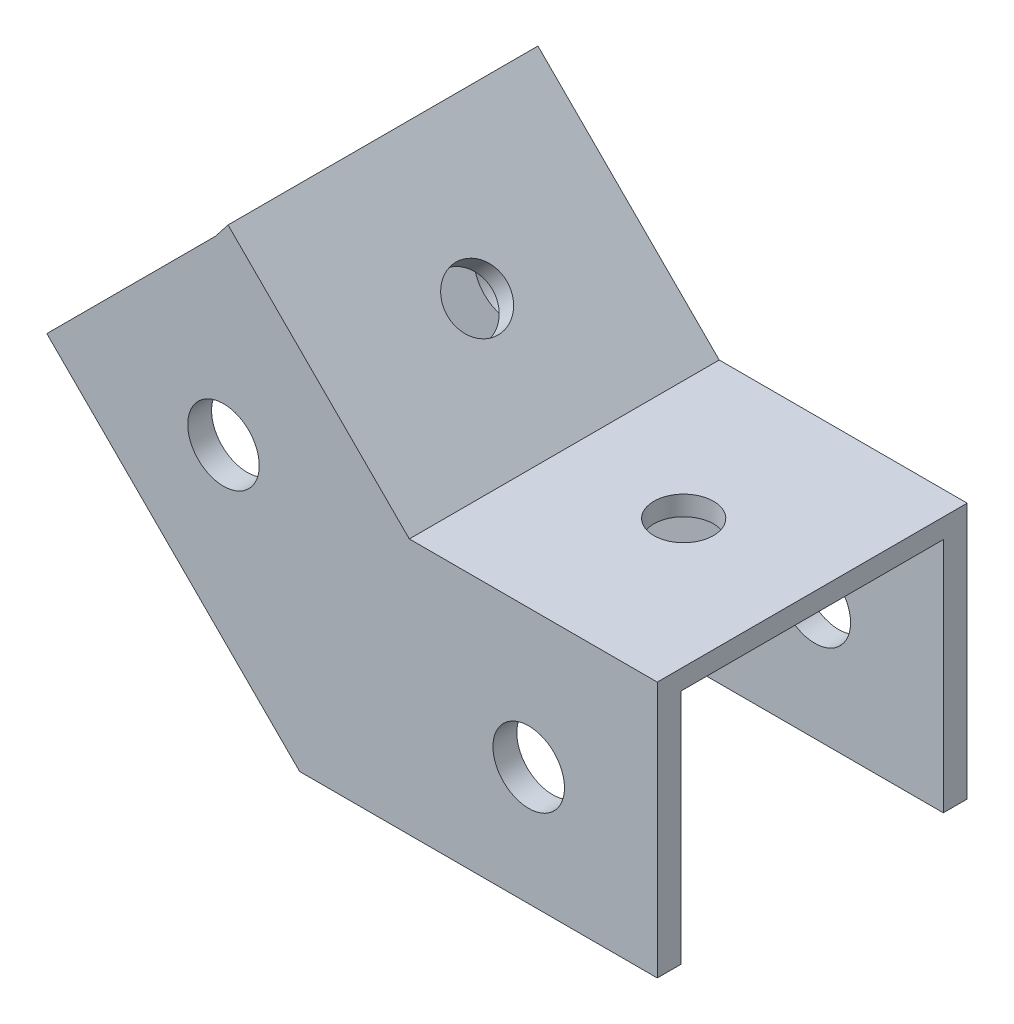
ISO-10303-21;
HEADER;
FILE_DESCRIPTION(('STEP AP214'),'2;1');
FILE_NAME('part.step','',(''),(''),'','','');
FILE_SCHEMA(('AUTOMOTIVE_DESIGN { 1 0 10303 214 1 1 1 1 }'));
ENDSEC;
DATA;
#1=APPLICATION_CONTEXT('core data for automotive mechanical design processes');
#2=APPLICATION_PROTOCOL_DEFINITION('international standard','automotive_design',2000,#1);
#3=PRODUCT_CONTEXT('',#1,'mechanical');
#4=PRODUCT('Part','Part','',(#3));
#5=PRODUCT_RELATED_PRODUCT_CATEGORY('part','',(#4));
#6=PRODUCT_DEFINITION_FORMATION('','',#4);
#7=PRODUCT_DEFINITION_CONTEXT('part definition',#1,'design');
#8=PRODUCT_DEFINITION('design','',#6,#7);
#9=PRODUCT_DEFINITION_SHAPE('','',#8);
#10=(LENGTH_UNIT() NAMED_UNIT(*) SI_UNIT(.MILLI.,.METRE.));
#11=(NAMED_UNIT(*) PLANE_ANGLE_UNIT() SI_UNIT($,.RADIAN.));
#12=(NAMED_UNIT(*) SI_UNIT($,.STERADIAN.) SOLID_ANGLE_UNIT());
#13=UNCERTAINTY_MEASURE_WITH_UNIT(LENGTH_MEASURE(1.E-05),#10,'distance_accuracy_value','');
#14=(GEOMETRIC_REPRESENTATION_CONTEXT(3) GLOBAL_UNCERTAINTY_ASSIGNED_CONTEXT((#13)) GLOBAL_UNIT_ASSIGNED_CONTEXT((#10,
#11,#12)) REPRESENTATION_CONTEXT('',''));
#15=CARTESIAN_POINT('',(0.,0.,0.));
#16=DIRECTION('',(0.,0.,1.));
#17=DIRECTION('',(1.,0.,0.));
#18=AXIS2_PLACEMENT_3D('',#15,#16,#17);
#19=CARTESIAN_POINT('',(29.6036555499137,-29.6036555499137,2.));
#20=DIRECTION('',(-0.707106781186548,0.707106781186547,0.));
#21=DIRECTION('',(-0.707106781186547,-0.707106781186548,0.));
#22=AXIS2_PLACEMENT_3D('',#19,#20,#21);
#23=PLANE('',#22);
#24=DIRECTION('',(0.707106781186547,0.707106781186548,0.));
#25=VECTOR('',#24,1.);
#26=CARTESIAN_POINT('',(29.6036555499137,-29.6036555499137,0.));
#27=LINE('',#26,#25);
#28=CARTESIAN_POINT('',(-93.5794854645758,-152.786796564403,0.));
#29=VERTEX_POINT('',#28);
#30=CARTESIAN_POINT('',(-79.4373498408449,-138.644660940672,0.));
#31=VERTEX_POINT('',#30);
#32=EDGE_CURVE('E241',#29,#31,#27,.T.);
#33=ORIENTED_EDGE('',*,*,#32,.F.);
#34=DIRECTION('',(0.,0.,-1.));
#35=VECTOR('',#34,1.);
#36=CARTESIAN_POINT('',(-93.5794854645758,-152.786796564403,2.));
#37=LINE('',#36,#35);
#38=CARTESIAN_POINT('',(-93.5794854645758,-152.786796564403,2.));
#39=VERTEX_POINT('',#38);
#40=EDGE_CURVE('E44',#39,#29,#37,.T.);
#41=ORIENTED_EDGE('',*,*,#40,.F.);
#42=DIRECTION('',(0.707106781186547,0.707106781186548,0.));
#43=VECTOR('',#42,1.);
#44=CARTESIAN_POINT('',(29.6036555499137,-29.6036555499137,2.));
#45=LINE('',#44,#43);
#46=CARTESIAN_POINT('',(-79.4373498408449,-138.644660940672,2.));
#47=VERTEX_POINT('',#46);
#48=EDGE_CURVE('E83',#39,#47,#45,.T.);
#49=ORIENTED_EDGE('',*,*,#48,.T.);
#50=DIRECTION('',(0.,0.,-1.));
#51=VECTOR('',#50,1.);
#52=CARTESIAN_POINT('',(-79.4373498408449,-138.644660940672,2.));
#53=LINE('',#52,#51);
#54=EDGE_CURVE('E11',#47,#31,#53,.T.);
#55=ORIENTED_EDGE('',*,*,#54,.T.);
#56=EDGE_LOOP('',(#33,#41,#49,#55));
#57=FACE_BOUND('',#56,.T.);
#58=ADVANCED_FACE('F35',(#57),#23,.T.);
#59=CARTESIAN_POINT('',(-123.18314101449,-123.18314101449,2.));
#60=DIRECTION('',(-0.707106781186547,-0.707106781186547,0.));
#61=DIRECTION('',(0.707106781186548,-0.707106781186548,0.));
#62=AXIS2_PLACEMENT_3D('',#59,#60,#61);
#63=PLANE('',#62);
#64=DIRECTION('',(-0.707106781186548,0.707106781186548,0.));
#65=VECTOR('',#64,1.);
#66=CARTESIAN_POINT('',(-123.18314101449,-123.18314101449,0.));
#67=LINE('',#66,#65);
#68=CARTESIAN_POINT('',(-72.3662820289794,-174.,0.));
#69=VERTEX_POINT('',#68);
#70=EDGE_CURVE('E244',#69,#29,#67,.T.);
#71=ORIENTED_EDGE('',*,*,#70,.F.);
#72=DIRECTION('',(0.,0.,-1.));
#73=VECTOR('',#72,1.);
#74=CARTESIAN_POINT('',(-72.3662820289794,-174.,2.));
#75=LINE('',#74,#73);
#76=CARTESIAN_POINT('',(-72.3662820289794,-174.,2.));
#77=VERTEX_POINT('',#76);
#78=EDGE_CURVE('E254',#77,#69,#75,.T.);
#79=ORIENTED_EDGE('',*,*,#78,.F.);
#80=DIRECTION('',(-0.707106781186548,0.707106781186548,0.));
#81=VECTOR('',#80,1.);
#82=CARTESIAN_POINT('',(-123.18314101449,-123.18314101449,2.));
#83=LINE('',#82,#81);
#84=EDGE_CURVE('E227',#77,#39,#83,.T.);
#85=ORIENTED_EDGE('',*,*,#84,.T.);
#86=ORIENTED_EDGE('',*,*,#40,.T.);
#87=EDGE_LOOP('',(#71,#79,#85,#86));
#88=FACE_BOUND('',#87,.T.);
#89=ADVANCED_FACE('F258',(#88),#63,.T.);
#90=CARTESIAN_POINT('',(0.,-174.,2.));
#91=DIRECTION('',(0.,-1.,0.));
#92=DIRECTION('',(0.,0.,-1.));
#93=AXIS2_PLACEMENT_3D('',#90,#91,#92);
#94=PLANE('',#93);
#95=DIRECTION('',(-1.,0.,0.));
#96=VECTOR('',#95,1.);
#97=CARTESIAN_POINT('',(0.,-174.,0.));
#98=LINE('',#97,#96);
#99=CARTESIAN_POINT('',(-42.3662820289794,-174.,0.));
#100=VERTEX_POINT('',#99);
#101=EDGE_CURVE('E247',#100,#69,#98,.T.);
#102=ORIENTED_EDGE('',*,*,#101,.F.);
#103=DIRECTION('',(0.,0.,-1.));
#104=VECTOR('',#103,1.);
#105=CARTESIAN_POINT('',(-42.3662820289794,-174.,2.));
#106=LINE('',#105,#104);
#107=CARTESIAN_POINT('',(-42.3662820289794,-174.,2.));
#108=VERTEX_POINT('',#107);
#109=EDGE_CURVE('E52',#108,#100,#106,.T.);
#110=ORIENTED_EDGE('',*,*,#109,.F.);
#111=DIRECTION('',(-1.,0.,0.));
#112=VECTOR('',#111,1.);
#113=CARTESIAN_POINT('',(0.,-174.,2.));
#114=LINE('',#113,#112);
#115=EDGE_CURVE('E230',#108,#77,#114,.T.);
#116=ORIENTED_EDGE('',*,*,#115,.T.);
#117=ORIENTED_EDGE('',*,*,#78,.T.);
#118=EDGE_LOOP('',(#102,#110,#116,#117));
#119=FACE_BOUND('',#118,.T.);
#120=ADVANCED_FACE('F262',(#119),#94,.T.);
#121=CARTESIAN_POINT('',(-42.3662820289794,0.,2.));
#122=DIRECTION('',(1.,0.,0.));
#123=DIRECTION('',(0.,0.,-1.));
#124=AXIS2_PLACEMENT_3D('',#121,#122,#123);
#125=PLANE('',#124);
#126=DIRECTION('',(0.,-1.,0.));
#127=VECTOR('',#126,1.);
#128=CARTESIAN_POINT('',(-42.3662820289794,0.,0.));
#129=LINE('',#128,#127);
#130=CARTESIAN_POINT('',(-42.3662820289794,-154.14656108803,0.));
#131=VERTEX_POINT('',#130);
#132=EDGE_CURVE('E250',#131,#100,#129,.T.);
#133=ORIENTED_EDGE('',*,*,#132,.F.);
#134=DIRECTION('',(0.,0.,1.));
#135=VECTOR('',#134,1.);
#136=CARTESIAN_POINT('',(-42.3662820289794,-154.14656108803,-11.));
#137=LINE('',#136,#135);
#138=CARTESIAN_POINT('',(-42.3662820289794,-154.14656108803,-22.));
#139=VERTEX_POINT('',#138);
#140=EDGE_CURVE('E147',#139,#131,#137,.T.);
#141=ORIENTED_EDGE('',*,*,#140,.F.);
#142=DIRECTION('',(0.,-1.,0.));
#143=VECTOR('',#142,1.);
#144=CARTESIAN_POINT('',(-42.3662820289794,0.,-22.));
#145=LINE('',#144,#143);
#146=CARTESIAN_POINT('',(-42.3662820289794,-174.,-22.));
#147=VERTEX_POINT('',#146);
#148=EDGE_CURVE('E187',#139,#147,#145,.T.);
#149=ORIENTED_EDGE('',*,*,#148,.T.);
#150=DIRECTION('',(0.,0.,1.));
#151=VECTOR('',#150,1.);
#152=CARTESIAN_POINT('',(-42.3662820289794,-174.,-24.));
#153=LINE('',#152,#151);
#154=CARTESIAN_POINT('',(-42.3662820289794,-174.,-24.));
#155=VERTEX_POINT('',#154);
#156=EDGE_CURVE('E160',#155,#147,#153,.T.);
#157=ORIENTED_EDGE('',*,*,#156,.F.);
#158=DIRECTION('',(0.,-1.,0.));
#159=VECTOR('',#158,1.);
#160=CARTESIAN_POINT('',(-42.3662820289794,0.,-24.));
#161=LINE('',#160,#159);
#162=CARTESIAN_POINT('',(-42.3662820289794,-152.5,-24.));
#163=VERTEX_POINT('',#162);
#164=EDGE_CURVE('E152',#163,#155,#161,.T.);
#165=ORIENTED_EDGE('',*,*,#164,.F.);
#166=DIRECTION('',(0.,0.,1.));
#167=VECTOR('',#166,1.);
#168=CARTESIAN_POINT('',(-42.3662820289794,-152.5,-11.));
#169=LINE('',#168,#167);
#170=CARTESIAN_POINT('',(-42.3662820289794,-152.5,2.));
#171=VERTEX_POINT('',#170);
#172=EDGE_CURVE('E138',#163,#171,#169,.T.);
#173=ORIENTED_EDGE('',*,*,#172,.T.);
#174=DIRECTION('',(0.,-1.,0.));
#175=VECTOR('',#174,1.);
#176=CARTESIAN_POINT('',(-42.3662820289794,0.,2.));
#177=LINE('',#176,#175);
#178=EDGE_CURVE('E232',#171,#108,#177,.T.);
#179=ORIENTED_EDGE('',*,*,#178,.T.);
#180=ORIENTED_EDGE('',*,*,#109,.T.);
#181=EDGE_LOOP('',(#133,#141,#149,#157,#165,#173,#179,#180));
#182=FACE_BOUND('',#181,.T.);
#183=ADVANCED_FACE('F158',(#182),#125,.T.);
#184=CARTESIAN_POINT('',(-78.7574675790314,-153.466678826217,2.));
#185=DIRECTION('',(0.,0.,-1.));
#186=DIRECTION('',(-1.,0.,0.));
#187=AXIS2_PLACEMENT_3D('',#184,#185,#186);
#188=CYLINDRICAL_SURFACE('',#187,3.00000000000001);
#189=CARTESIAN_POINT('',(-78.7574675790314,-153.466678826217,2.));
#190=DIRECTION('',(0.,0.,1.));
#191=DIRECTION('',(1.,0.,0.));
#192=AXIS2_PLACEMENT_3D('',#189,#190,#191);
#193=CIRCLE('',#192,3.00000000000001);
#194=CARTESIAN_POINT('',(-75.7574675790314,-153.466678826217,2.));
#195=VERTEX_POINT('',#194);
#196=EDGE_CURVE('E223',#195,#195,#193,.T.);
#197=ORIENTED_EDGE('',*,*,#196,.T.);
#198=EDGE_LOOP('',(#197));
#199=FACE_BOUND('',#198,.T.);
#200=CARTESIAN_POINT('',(-78.7574675790314,-153.466678826217,0.));
#201=DIRECTION('',(0.,0.,1.));
#202=DIRECTION('',(1.,0.,0.));
#203=AXIS2_PLACEMENT_3D('',#200,#201,#202);
#204=CIRCLE('',#203,3.00000000000001);
#205=CARTESIAN_POINT('',(-75.7574675790314,-153.466678826217,0.));
#206=VERTEX_POINT('',#205);
#207=EDGE_CURVE('E236',#206,#206,#204,.T.);
#208=ORIENTED_EDGE('',*,*,#207,.F.);
#209=EDGE_LOOP('',(#208));
#210=FACE_BOUND('',#209,.T.);
#211=ADVANCED_FACE('F335',(#199,#210),#188,.F.);
#212=CARTESIAN_POINT('',(-53.1508658612332,-164.073280544015,2.));
#213=DIRECTION('',(0.,0.,-1.));
#214=DIRECTION('',(-1.,0.,0.));
#215=AXIS2_PLACEMENT_3D('',#212,#213,#214);
#216=CYLINDRICAL_SURFACE('',#215,3.);
#217=CARTESIAN_POINT('',(-53.1508658612332,-164.073280544015,2.));
#218=DIRECTION('',(0.,0.,1.));
#219=DIRECTION('',(1.,0.,0.));
#220=AXIS2_PLACEMENT_3D('',#217,#218,#219);
#221=CIRCLE('',#220,3.);
#222=CARTESIAN_POINT('',(-50.1508658612332,-164.073280544015,2.));
#223=VERTEX_POINT('',#222);
#224=EDGE_CURVE('E220',#223,#223,#221,.T.);
#225=ORIENTED_EDGE('',*,*,#224,.T.);
#226=EDGE_LOOP('',(#225));
#227=FACE_BOUND('',#226,.T.);
#228=CARTESIAN_POINT('',(-53.1508658612332,-164.073280544015,0.));
#229=DIRECTION('',(0.,0.,1.));
#230=DIRECTION('',(1.,0.,0.));
#231=AXIS2_PLACEMENT_3D('',#228,#229,#230);
#232=CIRCLE('',#231,3.);
#233=CARTESIAN_POINT('',(-50.1508658612332,-164.073280544015,0.));
#234=VERTEX_POINT('',#233);
#235=EDGE_CURVE('E212',#234,#234,#232,.T.);
#236=ORIENTED_EDGE('',*,*,#235,.F.);
#237=EDGE_LOOP('',(#236));
#238=FACE_BOUND('',#237,.T.);
#239=ADVANCED_FACE('F37',(#227,#238),#216,.F.);
#240=CARTESIAN_POINT('',(0.,0.,2.));
#241=DIRECTION('',(0.,0.,1.));
#242=DIRECTION('',(1.,0.,0.));
#243=AXIS2_PLACEMENT_3D('',#240,#241,#242);
#244=PLANE('',#243);
#245=ORIENTED_EDGE('',*,*,#224,.F.);
#246=EDGE_LOOP('',(#245));
#247=FACE_BOUND('',#246,.T.);
#248=ORIENTED_EDGE('',*,*,#196,.F.);
#249=EDGE_LOOP('',(#248));
#250=FACE_BOUND('',#249,.T.);
#251=DIRECTION('',(0.616733081168651,0.787172348721817,0.));
#252=VECTOR('',#251,1.);
#253=CARTESIAN_POINT('',(18.0859645761652,-14.1699751993032,2.));
#254=LINE('',#253,#252);
#255=CARTESIAN_POINT('',(-78.3766896690651,-137.290878592831,2.));
#256=VERTEX_POINT('',#255);
#257=EDGE_CURVE('E205',#47,#256,#254,.T.);
#258=ORIENTED_EDGE('',*,*,#257,.F.);
#259=ORIENTED_EDGE('',*,*,#48,.F.);
#260=ORIENTED_EDGE('',*,*,#84,.F.);
#261=ORIENTED_EDGE('',*,*,#115,.F.);
#262=ORIENTED_EDGE('',*,*,#178,.F.);
#263=DIRECTION('',(1.,0.,0.));
#264=VECTOR('',#263,1.);
#265=CARTESIAN_POINT('',(0.,-152.5,2.));
#266=LINE('',#265,#264);
#267=CARTESIAN_POINT('',(-63.1675682618965,-152.5,2.));
#268=VERTEX_POINT('',#267);
#269=EDGE_CURVE('E144',#268,#171,#266,.T.);
#270=ORIENTED_EDGE('',*,*,#269,.F.);
#271=DIRECTION('',(-0.707106781186552,0.707106781186543,0.));
#272=VECTOR('',#271,1.);
#273=CARTESIAN_POINT('',(-107.833784130948,-107.833784130949,2.));
#274=LINE('',#273,#272);
#275=EDGE_CURVE('E202',#268,#256,#274,.T.);
#276=ORIENTED_EDGE('',*,*,#275,.T.);
#277=EDGE_LOOP('',(#258,#259,#260,#261,#262,#270,#276));
#278=FACE_BOUND('',#277,.T.);
#279=ADVANCED_FACE('F265',(#247,#250,#278),#244,.T.);
#280=CARTESIAN_POINT('',(0.,0.,0.));
#281=DIRECTION('',(0.,0.,1.));
#282=DIRECTION('',(1.,0.,0.));
#283=AXIS2_PLACEMENT_3D('',#280,#281,#282);
#284=PLANE('',#283);
#285=ORIENTED_EDGE('',*,*,#235,.T.);
#286=EDGE_LOOP('',(#285));
#287=FACE_BOUND('',#286,.T.);
#288=ORIENTED_EDGE('',*,*,#207,.T.);
#289=EDGE_LOOP('',(#288));
#290=FACE_BOUND('',#289,.T.);
#291=DIRECTION('',(0.707106781186548,-0.707106781186547,0.));
#292=VECTOR('',#291,1.);
#293=CARTESIAN_POINT('',(-109.041005390759,-109.041005390759,0.));
#294=LINE('',#293,#292);
#295=CARTESIAN_POINT('',(-63.935449693487,-154.14656108803,0.));
#296=VERTEX_POINT('',#295);
#297=EDGE_CURVE('E239',#31,#296,#294,.T.);
#298=ORIENTED_EDGE('',*,*,#297,.T.);
#299=DIRECTION('',(-1.,0.,0.));
#300=VECTOR('',#299,1.);
#301=CARTESIAN_POINT('',(0.,-154.14656108803,0.));
#302=LINE('',#301,#300);
#303=EDGE_CURVE('E77',#131,#296,#302,.T.);
#304=ORIENTED_EDGE('',*,*,#303,.F.);
#305=ORIENTED_EDGE('',*,*,#132,.T.);
#306=ORIENTED_EDGE('',*,*,#101,.T.);
#307=ORIENTED_EDGE('',*,*,#70,.T.);
#308=ORIENTED_EDGE('',*,*,#32,.T.);
#309=EDGE_LOOP('',(#298,#304,#305,#306,#307,#308));
#310=FACE_BOUND('',#309,.T.);
#311=ADVANCED_FACE('F261',(#287,#290,#310),#284,.F.);
#312=CARTESIAN_POINT('',(-109.041005390759,-109.041005390759,-11.));
#313=DIRECTION('',(0.707106781186547,0.707106781186548,0.));
#314=DIRECTION('',(-0.707106781186548,0.707106781186547,0.));
#315=AXIS2_PLACEMENT_3D('',#312,#313,#314);
#316=PLANE('',#315);
#317=CARTESIAN_POINT('',(-71.6863997671659,-146.395611014351,-11.));
#318=DIRECTION('',(-0.707106781186547,-0.707106781186548,0.));
#319=DIRECTION('',(0.707106781186548,-0.707106781186547,0.));
#320=AXIS2_PLACEMENT_3D('',#317,#318,#319);
#321=CIRCLE('',#320,2.49999999999999);
#322=CARTESIAN_POINT('',(-69.9186328141996,-148.163377967318,-11.));
#323=VERTEX_POINT('',#322);
#324=EDGE_CURVE('E308',#323,#323,#321,.T.);
#325=ORIENTED_EDGE('',*,*,#324,.F.);
#326=EDGE_LOOP('',(#325));
#327=FACE_BOUND('',#326,.T.);
#328=DIRECTION('',(0.,0.,1.));
#329=VECTOR('',#328,1.);
#330=CARTESIAN_POINT('',(-63.935449693487,-154.14656108803,-11.));
#331=LINE('',#330,#329);
#332=CARTESIAN_POINT('',(-63.935449693487,-154.14656108803,-22.));
#333=VERTEX_POINT('',#332);
#334=EDGE_CURVE('E208',#333,#296,#331,.T.);
#335=ORIENTED_EDGE('',*,*,#334,.T.);
#336=ORIENTED_EDGE('',*,*,#297,.F.);
#337=DIRECTION('',(0.,0.,1.));
#338=VECTOR('',#337,1.);
#339=CARTESIAN_POINT('',(-79.4373498408449,-138.644660940672,-11.));
#340=LINE('',#339,#338);
#341=CARTESIAN_POINT('',(-79.4373498408449,-138.644660940672,-22.));
#342=VERTEX_POINT('',#341);
#343=EDGE_CURVE('E209',#342,#31,#340,.T.);
#344=ORIENTED_EDGE('',*,*,#343,.F.);
#345=DIRECTION('',(0.707106781186548,-0.707106781186547,0.));
#346=VECTOR('',#345,1.);
#347=CARTESIAN_POINT('',(-109.041005390759,-109.041005390759,-22.));
#348=LINE('',#347,#346);
#349=EDGE_CURVE('E177',#342,#333,#348,.T.);
#350=ORIENTED_EDGE('',*,*,#349,.T.);
#351=EDGE_LOOP('',(#335,#336,#344,#350));
#352=FACE_BOUND('',#351,.T.);
#353=ADVANCED_FACE('F272',(#327,#352),#316,.F.);
#354=CARTESIAN_POINT('',(0.,-154.14656108803,-11.));
#355=DIRECTION('',(0.,1.,0.));
#356=DIRECTION('',(0.,0.,1.));
#357=AXIS2_PLACEMENT_3D('',#354,#355,#356);
#358=PLANE('',#357);
#359=CARTESIAN_POINT('',(-53.1508658612332,-154.14656108803,-11.));
#360=DIRECTION('',(0.,-1.,0.));
#361=DIRECTION('',(0.,0.,-1.));
#362=AXIS2_PLACEMENT_3D('',#359,#360,#361);
#363=CIRCLE('',#362,2.5);
#364=CARTESIAN_POINT('',(-53.1508658612332,-154.14656108803,-13.5));
#365=VERTEX_POINT('',#364);
#366=EDGE_CURVE('E305',#365,#365,#363,.T.);
#367=ORIENTED_EDGE('',*,*,#366,.F.);
#368=EDGE_LOOP('',(#367));
#369=FACE_BOUND('',#368,.T.);
#370=ORIENTED_EDGE('',*,*,#140,.T.);
#371=ORIENTED_EDGE('',*,*,#303,.T.);
#372=ORIENTED_EDGE('',*,*,#334,.F.);
#373=DIRECTION('',(-1.,0.,0.));
#374=VECTOR('',#373,1.);
#375=CARTESIAN_POINT('',(0.,-154.14656108803,-22.));
#376=LINE('',#375,#374);
#377=EDGE_CURVE('E189',#139,#333,#376,.T.);
#378=ORIENTED_EDGE('',*,*,#377,.F.);
#379=EDGE_LOOP('',(#370,#371,#372,#378));
#380=FACE_BOUND('',#379,.T.);
#381=ADVANCED_FACE('F281',(#369,#380),#358,.F.);
#382=CARTESIAN_POINT('',(18.0859645761652,-14.1699751993032,-11.));
#383=DIRECTION('',(0.787172348721817,-0.616733081168651,0.));
#384=DIRECTION('',(0.616733081168651,0.787172348721817,0.));
#385=AXIS2_PLACEMENT_3D('',#382,#383,#384);
#386=PLANE('',#385);
#387=ORIENTED_EDGE('',*,*,#257,.T.);
#388=DIRECTION('',(0.,0.,1.));
#389=VECTOR('',#388,1.);
#390=CARTESIAN_POINT('',(-78.3766896690651,-137.290878592831,-11.));
#391=LINE('',#390,#389);
#392=CARTESIAN_POINT('',(-78.3766896690651,-137.290878592831,-24.));
#393=VERTEX_POINT('',#392);
#394=EDGE_CURVE('E213',#393,#256,#391,.T.);
#395=ORIENTED_EDGE('',*,*,#394,.F.);
#396=DIRECTION('',(0.616733081168651,0.787172348721817,0.));
#397=VECTOR('',#396,1.);
#398=CARTESIAN_POINT('',(18.0859645761652,-14.1699751993032,-24.));
#399=LINE('',#398,#397);
#400=CARTESIAN_POINT('',(-79.4373498408449,-138.644660940672,-24.));
#401=VERTEX_POINT('',#400);
#402=EDGE_CURVE('E174',#401,#393,#399,.T.);
#403=ORIENTED_EDGE('',*,*,#402,.F.);
#404=DIRECTION('',(0.,0.,1.));
#405=VECTOR('',#404,1.);
#406=CARTESIAN_POINT('',(-79.4373498408449,-138.644660940672,-24.));
#407=LINE('',#406,#405);
#408=EDGE_CURVE('E198',#401,#342,#407,.T.);
#409=ORIENTED_EDGE('',*,*,#408,.T.);
#410=ORIENTED_EDGE('',*,*,#343,.T.);
#411=ORIENTED_EDGE('',*,*,#54,.F.);
#412=EDGE_LOOP('',(#387,#395,#403,#409,#410,#411));
#413=FACE_BOUND('',#412,.T.);
#414=ADVANCED_FACE('F268',(#413),#386,.F.);
#415=CARTESIAN_POINT('',(-107.833784130948,-107.833784130949,-11.));
#416=DIRECTION('',(0.707106781186543,0.707106781186552,0.));
#417=DIRECTION('',(-0.707106781186552,0.707106781186543,0.));
#418=AXIS2_PLACEMENT_3D('',#415,#416,#417);
#419=PLANE('',#418);
#420=CARTESIAN_POINT('',(-70.4791785073555,-145.188389754541,-11.));
#421=DIRECTION('',(0.707106781186543,0.707106781186552,0.));
#422=DIRECTION('',(-0.707106781186552,0.707106781186543,0.));
#423=AXIS2_PLACEMENT_3D('',#420,#421,#422);
#424=CIRCLE('',#423,2.49999999999999);
#425=CARTESIAN_POINT('',(-72.2469454603219,-143.420622801575,-11.));
#426=VERTEX_POINT('',#425);
#427=EDGE_CURVE('E309',#426,#426,#424,.F.);
#428=ORIENTED_EDGE('',*,*,#427,.T.);
#429=EDGE_LOOP('',(#428));
#430=FACE_BOUND('',#429,.T.);
#431=ORIENTED_EDGE('',*,*,#275,.F.);
#432=DIRECTION('',(0.,0.,1.));
#433=VECTOR('',#432,1.);
#434=CARTESIAN_POINT('',(-63.1675682618965,-152.5,-11.));
#435=LINE('',#434,#433);
#436=CARTESIAN_POINT('',(-63.1675682618965,-152.5,-24.));
#437=VERTEX_POINT('',#436);
#438=EDGE_CURVE('E146',#437,#268,#435,.T.);
#439=ORIENTED_EDGE('',*,*,#438,.F.);
#440=DIRECTION('',(-0.707106781186552,0.707106781186543,0.));
#441=VECTOR('',#440,1.);
#442=CARTESIAN_POINT('',(-107.833784130948,-107.833784130949,-24.));
#443=LINE('',#442,#441);
#444=EDGE_CURVE('E155',#437,#393,#443,.T.);
#445=ORIENTED_EDGE('',*,*,#444,.T.);
#446=ORIENTED_EDGE('',*,*,#394,.T.);
#447=EDGE_LOOP('',(#431,#439,#445,#446));
#448=FACE_BOUND('',#447,.T.);
#449=ADVANCED_FACE('F377',(#430,#448),#419,.T.);
#450=CARTESIAN_POINT('',(0.,-152.5,-11.));
#451=DIRECTION('',(0.,-1.,0.));
#452=DIRECTION('',(0.,0.,-1.));
#453=AXIS2_PLACEMENT_3D('',#450,#451,#452);
#454=PLANE('',#453);
#455=CARTESIAN_POINT('',(-53.1508658612332,-152.5,-11.));
#456=DIRECTION('',(0.,-1.,0.));
#457=DIRECTION('',(0.,0.,-1.));
#458=AXIS2_PLACEMENT_3D('',#455,#456,#457);
#459=CIRCLE('',#458,2.5);
#460=CARTESIAN_POINT('',(-53.1508658612332,-152.5,-13.5));
#461=VERTEX_POINT('',#460);
#462=EDGE_CURVE('E156',#461,#461,#459,.F.);
#463=ORIENTED_EDGE('',*,*,#462,.F.);
#464=EDGE_LOOP('',(#463));
#465=FACE_BOUND('',#464,.T.);
#466=ORIENTED_EDGE('',*,*,#269,.T.);
#467=ORIENTED_EDGE('',*,*,#172,.F.);
#468=DIRECTION('',(1.,0.,0.));
#469=VECTOR('',#468,1.);
#470=CARTESIAN_POINT('',(0.,-152.5,-24.));
#471=LINE('',#470,#469);
#472=EDGE_CURVE('E141',#437,#163,#471,.T.);
#473=ORIENTED_EDGE('',*,*,#472,.F.);
#474=ORIENTED_EDGE('',*,*,#438,.T.);
#475=EDGE_LOOP('',(#466,#467,#473,#474));
#476=FACE_BOUND('',#475,.T.);
#477=ADVANCED_FACE('F140',(#465,#476),#454,.F.);
#478=CARTESIAN_POINT('',(29.6036555499137,-29.6036555499137,-24.));
#479=DIRECTION('',(-0.707106781186548,0.707106781186547,0.));
#480=DIRECTION('',(-0.707106781186547,-0.707106781186548,0.));
#481=AXIS2_PLACEMENT_3D('',#478,#479,#480);
#482=PLANE('',#481);
#483=DIRECTION('',(0.707106781186547,0.707106781186548,0.));
#484=VECTOR('',#483,1.);
#485=CARTESIAN_POINT('',(29.6036555499137,-29.6036555499137,-22.));
#486=LINE('',#485,#484);
#487=CARTESIAN_POINT('',(-93.5794854645758,-152.786796564403,-22.));
#488=VERTEX_POINT('',#487);
#489=EDGE_CURVE('E180',#488,#342,#486,.T.);
#490=ORIENTED_EDGE('',*,*,#489,.T.);
#491=ORIENTED_EDGE('',*,*,#408,.F.);
#492=DIRECTION('',(0.707106781186547,0.707106781186548,0.));
#493=VECTOR('',#492,1.);
#494=CARTESIAN_POINT('',(29.6036555499137,-29.6036555499137,-24.));
#495=LINE('',#494,#493);
#496=CARTESIAN_POINT('',(-93.5794854645758,-152.786796564403,-24.));
#497=VERTEX_POINT('',#496);
#498=EDGE_CURVE('E293',#497,#401,#495,.T.);
#499=ORIENTED_EDGE('',*,*,#498,.F.);
#500=DIRECTION('',(0.,0.,1.));
#501=VECTOR('',#500,1.);
#502=CARTESIAN_POINT('',(-93.5794854645758,-152.786796564403,-24.));
#503=LINE('',#502,#501);
#504=EDGE_CURVE('E195',#497,#488,#503,.T.);
#505=ORIENTED_EDGE('',*,*,#504,.T.);
#506=EDGE_LOOP('',(#490,#491,#499,#505));
#507=FACE_BOUND('',#506,.T.);
#508=ADVANCED_FACE('F291',(#507),#482,.T.);
#509=CARTESIAN_POINT('',(-123.18314101449,-123.18314101449,-24.));
#510=DIRECTION('',(-0.707106781186547,-0.707106781186547,0.));
#511=DIRECTION('',(0.707106781186548,-0.707106781186548,0.));
#512=AXIS2_PLACEMENT_3D('',#509,#510,#511);
#513=PLANE('',#512);
#514=DIRECTION('',(-0.707106781186548,0.707106781186548,0.));
#515=VECTOR('',#514,1.);
#516=CARTESIAN_POINT('',(-123.18314101449,-123.18314101449,-22.));
#517=LINE('',#516,#515);
#518=CARTESIAN_POINT('',(-72.3662820289794,-174.,-22.));
#519=VERTEX_POINT('',#518);
#520=EDGE_CURVE('E183',#519,#488,#517,.T.);
#521=ORIENTED_EDGE('',*,*,#520,.T.);
#522=ORIENTED_EDGE('',*,*,#504,.F.);
#523=DIRECTION('',(-0.707106781186548,0.707106781186548,0.));
#524=VECTOR('',#523,1.);
#525=CARTESIAN_POINT('',(-123.18314101449,-123.18314101449,-24.));
#526=LINE('',#525,#524);
#527=CARTESIAN_POINT('',(-72.3662820289794,-174.,-24.));
#528=VERTEX_POINT('',#527);
#529=EDGE_CURVE('E166',#528,#497,#526,.T.);
#530=ORIENTED_EDGE('',*,*,#529,.F.);
#531=DIRECTION('',(0.,0.,1.));
#532=VECTOR('',#531,1.);
#533=CARTESIAN_POINT('',(-72.3662820289794,-174.,-24.));
#534=LINE('',#533,#532);
#535=EDGE_CURVE('E164',#528,#519,#534,.T.);
#536=ORIENTED_EDGE('',*,*,#535,.T.);
#537=EDGE_LOOP('',(#521,#522,#530,#536));
#538=FACE_BOUND('',#537,.T.);
#539=ADVANCED_FACE('F287',(#538),#513,.T.);
#540=CARTESIAN_POINT('',(0.,-174.,-24.));
#541=DIRECTION('',(0.,-1.,0.));
#542=DIRECTION('',(0.,0.,1.));
#543=AXIS2_PLACEMENT_3D('',#540,#541,#542);
#544=PLANE('',#543);
#545=DIRECTION('',(-1.,0.,0.));
#546=VECTOR('',#545,1.);
#547=CARTESIAN_POINT('',(0.,-174.,-22.));
#548=LINE('',#547,#546);
#549=EDGE_CURVE('E185',#147,#519,#548,.T.);
#550=ORIENTED_EDGE('',*,*,#549,.T.);
#551=ORIENTED_EDGE('',*,*,#535,.F.);
#552=DIRECTION('',(-1.,0.,0.));
#553=VECTOR('',#552,1.);
#554=CARTESIAN_POINT('',(0.,-174.,-24.));
#555=LINE('',#554,#553);
#556=EDGE_CURVE('E162',#155,#528,#555,.T.);
#557=ORIENTED_EDGE('',*,*,#556,.F.);
#558=ORIENTED_EDGE('',*,*,#156,.T.);
#559=EDGE_LOOP('',(#550,#551,#557,#558));
#560=FACE_BOUND('',#559,.T.);
#561=ADVANCED_FACE('F283',(#560),#544,.T.);
#562=CARTESIAN_POINT('',(-78.7574675790314,-153.466678826217,-24.));
#563=DIRECTION('',(0.,0.,1.));
#564=DIRECTION('',(-1.,0.,0.));
#565=AXIS2_PLACEMENT_3D('',#562,#563,#564);
#566=CYLINDRICAL_SURFACE('',#565,3.00000000000001);
#567=CARTESIAN_POINT('',(-78.7574675790314,-153.466678826217,-24.));
#568=DIRECTION('',(0.,0.,1.));
#569=DIRECTION('',(1.,0.,0.));
#570=AXIS2_PLACEMENT_3D('',#567,#568,#569);
#571=CIRCLE('',#570,3.00000000000001);
#572=CARTESIAN_POINT('',(-75.7574675790314,-153.466678826217,-24.));
#573=VERTEX_POINT('',#572);
#574=EDGE_CURVE('E294',#573,#573,#571,.T.);
#575=ORIENTED_EDGE('',*,*,#574,.F.);
#576=EDGE_LOOP('',(#575));
#577=FACE_BOUND('',#576,.T.);
#578=CARTESIAN_POINT('',(-78.7574675790314,-153.466678826217,-22.));
#579=DIRECTION('',(0.,0.,1.));
#580=DIRECTION('',(1.,0.,0.));
#581=AXIS2_PLACEMENT_3D('',#578,#579,#580);
#582=CIRCLE('',#581,3.00000000000001);
#583=CARTESIAN_POINT('',(-75.7574675790314,-153.466678826217,-22.));
#584=VERTEX_POINT('',#583);
#585=EDGE_CURVE('E173',#584,#584,#582,.T.);
#586=ORIENTED_EDGE('',*,*,#585,.T.);
#587=EDGE_LOOP('',(#586));
#588=FACE_BOUND('',#587,.T.);
#589=ADVANCED_FACE('F409',(#577,#588),#566,.F.);
#590=CARTESIAN_POINT('',(-53.1508658612332,-164.073280544015,-24.));
#591=DIRECTION('',(0.,0.,1.));
#592=DIRECTION('',(-1.,0.,0.));
#593=AXIS2_PLACEMENT_3D('',#590,#591,#592);
#594=CYLINDRICAL_SURFACE('',#593,3.);
#595=CARTESIAN_POINT('',(-53.1508658612332,-164.073280544015,-24.));
#596=DIRECTION('',(0.,0.,1.));
#597=DIRECTION('',(1.,0.,0.));
#598=AXIS2_PLACEMENT_3D('',#595,#596,#597);
#599=CIRCLE('',#598,3.);
#600=CARTESIAN_POINT('',(-50.1508658612332,-164.073280544015,-24.));
#601=VERTEX_POINT('',#600);
#602=EDGE_CURVE('E191',#601,#601,#599,.T.);
#603=ORIENTED_EDGE('',*,*,#602,.F.);
#604=EDGE_LOOP('',(#603));
#605=FACE_BOUND('',#604,.T.);
#606=CARTESIAN_POINT('',(-53.1508658612332,-164.073280544015,-22.));
#607=DIRECTION('',(0.,0.,1.));
#608=DIRECTION('',(1.,0.,0.));
#609=AXIS2_PLACEMENT_3D('',#606,#607,#608);
#610=CIRCLE('',#609,3.);
#611=CARTESIAN_POINT('',(-50.1508658612332,-164.073280544015,-22.));
#612=VERTEX_POINT('',#611);
#613=EDGE_CURVE('E170',#612,#612,#610,.T.);
#614=ORIENTED_EDGE('',*,*,#613,.T.);
#615=EDGE_LOOP('',(#614));
#616=FACE_BOUND('',#615,.T.);
#617=ADVANCED_FACE('F418',(#605,#616),#594,.F.);
#618=CARTESIAN_POINT('',(0.,0.,-24.));
#619=DIRECTION('',(0.,0.,-1.));
#620=DIRECTION('',(1.,0.,0.));
#621=AXIS2_PLACEMENT_3D('',#618,#619,#620);
#622=PLANE('',#621);
#623=ORIENTED_EDGE('',*,*,#602,.T.);
#624=EDGE_LOOP('',(#623));
#625=FACE_BOUND('',#624,.T.);
#626=ORIENTED_EDGE('',*,*,#574,.T.);
#627=EDGE_LOOP('',(#626));
#628=FACE_BOUND('',#627,.T.);
#629=ORIENTED_EDGE('',*,*,#402,.T.);
#630=ORIENTED_EDGE('',*,*,#444,.F.);
#631=ORIENTED_EDGE('',*,*,#472,.T.);
#632=ORIENTED_EDGE('',*,*,#164,.T.);
#633=ORIENTED_EDGE('',*,*,#556,.T.);
#634=ORIENTED_EDGE('',*,*,#529,.T.);
#635=ORIENTED_EDGE('',*,*,#498,.T.);
#636=EDGE_LOOP('',(#629,#630,#631,#632,#633,#634,#635));
#637=FACE_BOUND('',#636,.T.);
#638=ADVANCED_FACE('F151',(#625,#628,#637),#622,.T.);
#639=CARTESIAN_POINT('',(0.,0.,-22.));
#640=DIRECTION('',(0.,0.,-1.));
#641=DIRECTION('',(1.,0.,0.));
#642=AXIS2_PLACEMENT_3D('',#639,#640,#641);
#643=PLANE('',#642);
#644=ORIENTED_EDGE('',*,*,#613,.F.);
#645=EDGE_LOOP('',(#644));
#646=FACE_BOUND('',#645,.T.);
#647=ORIENTED_EDGE('',*,*,#585,.F.);
#648=EDGE_LOOP('',(#647));
#649=FACE_BOUND('',#648,.T.);
#650=ORIENTED_EDGE('',*,*,#349,.F.);
#651=ORIENTED_EDGE('',*,*,#489,.F.);
#652=ORIENTED_EDGE('',*,*,#520,.F.);
#653=ORIENTED_EDGE('',*,*,#549,.F.);
#654=ORIENTED_EDGE('',*,*,#148,.F.);
#655=ORIENTED_EDGE('',*,*,#377,.T.);
#656=EDGE_LOOP('',(#650,#651,#652,#653,#654,#655));
#657=FACE_BOUND('',#656,.T.);
#658=ADVANCED_FACE('F275',(#646,#649,#657),#643,.F.);
#659=CARTESIAN_POINT('',(-53.1508658612332,-137.289878592831,-11.));
#660=DIRECTION('',(0.,-1.,0.));
#661=DIRECTION('',(0.,0.,-1.));
#662=AXIS2_PLACEMENT_3D('',#659,#660,#661);
#663=CYLINDRICAL_SURFACE('',#662,2.5);
#664=ORIENTED_EDGE('',*,*,#366,.T.);
#665=EDGE_LOOP('',(#664));
#666=FACE_BOUND('',#665,.T.);
#667=ORIENTED_EDGE('',*,*,#462,.T.);
#668=EDGE_LOOP('',(#667));
#669=FACE_BOUND('',#668,.T.);
#670=ADVANCED_FACE('F448',(#666,#669),#663,.F.);
#671=CARTESIAN_POINT('',(-52.4729746873128,-127.182185934498,-11.));
#672=DIRECTION('',(-0.707106781186547,-0.707106781186548,0.));
#673=DIRECTION('',(0.707106781186548,-0.707106781186547,0.));
#674=AXIS2_PLACEMENT_3D('',#671,#672,#673);
#675=CYLINDRICAL_SURFACE('',#674,2.49999999999999);
#676=ORIENTED_EDGE('',*,*,#427,.F.);
#677=EDGE_LOOP('',(#676));
#678=FACE_BOUND('',#677,.T.);
#679=ORIENTED_EDGE('',*,*,#324,.T.);
#680=EDGE_LOOP('',(#679));
#681=FACE_BOUND('',#680,.T.);
#682=ADVANCED_FACE('F315',(#678,#681),#675,.F.);
#683=CLOSED_SHELL('',(#58,#89,#120,#183,#211,#239,#279,#311,#353,#381,#414,#449,#477,#508,#539,
#561,#589,#617,#638,#658,#670,#682));
#684=MANIFOLD_SOLID_BREP('B2',#683);
#685=ADVANCED_BREP_SHAPE_REPRESENTATION('',(#18,#684),#14);
#686=SHAPE_DEFINITION_REPRESENTATION(#9,#685);
ENDSEC;
END-ISO-10303-21;
